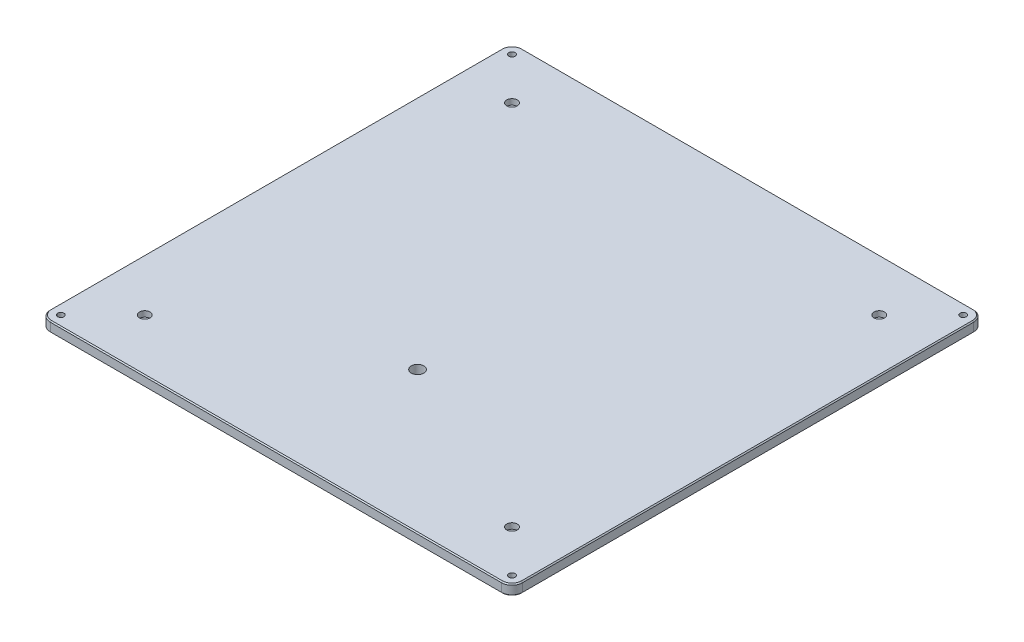
ISO-10303-21;
HEADER;
FILE_DESCRIPTION(('STEP AP214'),'2;1');
FILE_NAME('part.step','',(''),(''),'','','');
FILE_SCHEMA(('AUTOMOTIVE_DESIGN { 1 0 10303 214 1 1 1 1 }'));
ENDSEC;
DATA;
#1=APPLICATION_CONTEXT('core data for automotive mechanical design processes');
#2=APPLICATION_PROTOCOL_DEFINITION('international standard','automotive_design',2000,#1);
#3=PRODUCT_CONTEXT('',#1,'mechanical');
#4=PRODUCT('Part','Part','',(#3));
#5=PRODUCT_RELATED_PRODUCT_CATEGORY('part','',(#4));
#6=PRODUCT_DEFINITION_FORMATION('','',#4);
#7=PRODUCT_DEFINITION_CONTEXT('part definition',#1,'design');
#8=PRODUCT_DEFINITION('design','',#6,#7);
#9=PRODUCT_DEFINITION_SHAPE('','',#8);
#10=(LENGTH_UNIT() NAMED_UNIT(*) SI_UNIT(.MILLI.,.METRE.));
#11=(NAMED_UNIT(*) PLANE_ANGLE_UNIT() SI_UNIT($,.RADIAN.));
#12=(NAMED_UNIT(*) SI_UNIT($,.STERADIAN.) SOLID_ANGLE_UNIT());
#13=UNCERTAINTY_MEASURE_WITH_UNIT(LENGTH_MEASURE(1.E-05),#10,'distance_accuracy_value','');
#14=(GEOMETRIC_REPRESENTATION_CONTEXT(3) GLOBAL_UNCERTAINTY_ASSIGNED_CONTEXT((#13)) GLOBAL_UNIT_ASSIGNED_CONTEXT((#10,
#11,#12)) REPRESENTATION_CONTEXT('',''));
#15=CARTESIAN_POINT('',(0.,0.,0.));
#16=DIRECTION('',(0.,0.,1.));
#17=DIRECTION('',(1.,0.,0.));
#18=AXIS2_PLACEMENT_3D('',#15,#16,#17);
#19=CARTESIAN_POINT('',(175.,10.,175.));
#20=DIRECTION('',(0.,1.,0.));
#21=DIRECTION('',(0.,0.,1.));
#22=AXIS2_PLACEMENT_3D('',#19,#20,#21);
#23=CYLINDRICAL_SURFACE('',#22,5.);
#24=CARTESIAN_POINT('',(175.,4.6,175.));
#25=DIRECTION('',(0.,1.,0.));
#26=DIRECTION('',(0.,0.,1.));
#27=AXIS2_PLACEMENT_3D('',#24,#25,#26);
#28=CIRCLE('',#27,5.);
#29=CARTESIAN_POINT('',(175.,4.6,180.));
#30=VERTEX_POINT('',#29);
#31=EDGE_CURVE('E162',#30,#30,#28,.T.);
#32=ORIENTED_EDGE('',*,*,#31,.F.);
#33=EDGE_LOOP('',(#32));
#34=FACE_BOUND('',#33,.T.);
#35=CARTESIAN_POINT('',(175.,10.,175.));
#36=DIRECTION('',(0.,1.,0.));
#37=DIRECTION('',(0.,0.,1.));
#38=AXIS2_PLACEMENT_3D('',#35,#36,#37);
#39=CIRCLE('',#38,5.);
#40=CARTESIAN_POINT('',(175.,10.,180.));
#41=VERTEX_POINT('',#40);
#42=EDGE_CURVE('E310',#41,#41,#39,.T.);
#43=ORIENTED_EDGE('',*,*,#42,.T.);
#44=EDGE_LOOP('',(#43));
#45=FACE_BOUND('',#44,.T.);
#46=ADVANCED_FACE('F17',(#34,#45),#23,.F.);
#47=CARTESIAN_POINT('',(177.9,4.6,175.));
#48=DIRECTION('',(0.,-1.,0.));
#49=DIRECTION('',(0.,0.,-1.));
#50=AXIS2_PLACEMENT_3D('',#47,#48,#49);
#51=PLANE('',#50);
#52=CARTESIAN_POINT('',(175.,4.6,175.));
#53=DIRECTION('',(0.,1.,0.));
#54=DIRECTION('',(0.,0.,1.));
#55=AXIS2_PLACEMENT_3D('',#52,#53,#54);
#56=CIRCLE('',#55,2.9);
#57=CARTESIAN_POINT('',(175.,4.6,177.9));
#58=VERTEX_POINT('',#57);
#59=EDGE_CURVE('E316',#58,#58,#56,.T.);
#60=ORIENTED_EDGE('',*,*,#59,.F.);
#61=EDGE_LOOP('',(#60));
#62=FACE_BOUND('',#61,.T.);
#63=ORIENTED_EDGE('',*,*,#31,.T.);
#64=EDGE_LOOP('',(#63));
#65=FACE_BOUND('',#64,.T.);
#66=ADVANCED_FACE('F425',(#62,#65),#51,.F.);
#67=CARTESIAN_POINT('',(175.,10.,175.));
#68=DIRECTION('',(0.,1.,0.));
#69=DIRECTION('',(0.,0.,1.));
#70=AXIS2_PLACEMENT_3D('',#67,#68,#69);
#71=CYLINDRICAL_SURFACE('',#70,2.9);
#72=CARTESIAN_POINT('',(175.,0.,175.));
#73=DIRECTION('',(0.,1.,0.));
#74=DIRECTION('',(0.,0.,1.));
#75=AXIS2_PLACEMENT_3D('',#72,#73,#74);
#76=CIRCLE('',#75,2.9);
#77=CARTESIAN_POINT('',(175.,0.,177.9));
#78=VERTEX_POINT('',#77);
#79=EDGE_CURVE('E313',#78,#78,#76,.T.);
#80=ORIENTED_EDGE('',*,*,#79,.F.);
#81=EDGE_LOOP('',(#80));
#82=FACE_BOUND('',#81,.T.);
#83=ORIENTED_EDGE('',*,*,#59,.T.);
#84=EDGE_LOOP('',(#83));
#85=FACE_BOUND('',#84,.T.);
#86=ADVANCED_FACE('F431',(#82,#85),#71,.F.);
#87=CARTESIAN_POINT('',(-175.,10.,175.));
#88=DIRECTION('',(0.,1.,0.));
#89=DIRECTION('',(0.,0.,1.));
#90=AXIS2_PLACEMENT_3D('',#87,#88,#89);
#91=CYLINDRICAL_SURFACE('',#90,5.);
#92=CARTESIAN_POINT('',(-175.,4.6,175.));
#93=DIRECTION('',(0.,1.,0.));
#94=DIRECTION('',(0.,0.,1.));
#95=AXIS2_PLACEMENT_3D('',#92,#93,#94);
#96=CIRCLE('',#95,5.);
#97=CARTESIAN_POINT('',(-175.,4.6,180.));
#98=VERTEX_POINT('',#97);
#99=EDGE_CURVE('E307',#98,#98,#96,.T.);
#100=ORIENTED_EDGE('',*,*,#99,.F.);
#101=EDGE_LOOP('',(#100));
#102=FACE_BOUND('',#101,.T.);
#103=CARTESIAN_POINT('',(-175.,10.,175.));
#104=DIRECTION('',(0.,1.,0.));
#105=DIRECTION('',(0.,0.,1.));
#106=AXIS2_PLACEMENT_3D('',#103,#104,#105);
#107=CIRCLE('',#106,5.);
#108=CARTESIAN_POINT('',(-175.,10.,180.));
#109=VERTEX_POINT('',#108);
#110=EDGE_CURVE('E298',#109,#109,#107,.T.);
#111=ORIENTED_EDGE('',*,*,#110,.T.);
#112=EDGE_LOOP('',(#111));
#113=FACE_BOUND('',#112,.T.);
#114=ADVANCED_FACE('F439',(#102,#113),#91,.F.);
#115=CARTESIAN_POINT('',(-172.1,4.6,175.));
#116=DIRECTION('',(0.,-1.,0.));
#117=DIRECTION('',(0.,0.,-1.));
#118=AXIS2_PLACEMENT_3D('',#115,#116,#117);
#119=PLANE('',#118);
#120=CARTESIAN_POINT('',(-175.,4.6,175.));
#121=DIRECTION('',(0.,1.,0.));
#122=DIRECTION('',(0.,0.,1.));
#123=AXIS2_PLACEMENT_3D('',#120,#121,#122);
#124=CIRCLE('',#123,2.9);
#125=CARTESIAN_POINT('',(-175.,4.6,177.9));
#126=VERTEX_POINT('',#125);
#127=EDGE_CURVE('E304',#126,#126,#124,.T.);
#128=ORIENTED_EDGE('',*,*,#127,.F.);
#129=EDGE_LOOP('',(#128));
#130=FACE_BOUND('',#129,.T.);
#131=ORIENTED_EDGE('',*,*,#99,.T.);
#132=EDGE_LOOP('',(#131));
#133=FACE_BOUND('',#132,.T.);
#134=ADVANCED_FACE('F443',(#130,#133),#119,.F.);
#135=CARTESIAN_POINT('',(-175.,10.,175.));
#136=DIRECTION('',(0.,1.,0.));
#137=DIRECTION('',(0.,0.,1.));
#138=AXIS2_PLACEMENT_3D('',#135,#136,#137);
#139=CYLINDRICAL_SURFACE('',#138,2.9);
#140=CARTESIAN_POINT('',(-175.,0.,175.));
#141=DIRECTION('',(0.,1.,0.));
#142=DIRECTION('',(0.,0.,1.));
#143=AXIS2_PLACEMENT_3D('',#140,#141,#142);
#144=CIRCLE('',#143,2.9);
#145=CARTESIAN_POINT('',(-175.,0.,177.9));
#146=VERTEX_POINT('',#145);
#147=EDGE_CURVE('E301',#146,#146,#144,.T.);
#148=ORIENTED_EDGE('',*,*,#147,.F.);
#149=EDGE_LOOP('',(#148));
#150=FACE_BOUND('',#149,.T.);
#151=ORIENTED_EDGE('',*,*,#127,.T.);
#152=EDGE_LOOP('',(#151));
#153=FACE_BOUND('',#152,.T.);
#154=ADVANCED_FACE('F447',(#150,#153),#139,.F.);
#155=CARTESIAN_POINT('',(-215.,10.,215.));
#156=DIRECTION('',(0.,-1.,0.));
#157=DIRECTION('',(0.,0.,-1.));
#158=AXIS2_PLACEMENT_3D('',#155,#156,#157);
#159=CYLINDRICAL_SURFACE('',#158,10.);
#160=DIRECTION('',(0.,-1.,0.));
#161=VECTOR('',#160,1.);
#162=CARTESIAN_POINT('',(-225.,10.,215.));
#163=LINE('',#162,#161);
#164=CARTESIAN_POINT('',(-225.,9.,215.));
#165=VERTEX_POINT('',#164);
#166=CARTESIAN_POINT('',(-225.,1.00000000000006,215.));
#167=VERTEX_POINT('',#166);
#168=EDGE_CURVE('E281',#165,#167,#163,.T.);
#169=ORIENTED_EDGE('',*,*,#168,.T.);
#170=CARTESIAN_POINT('',(-215.,1.00000000000006,215.));
#171=DIRECTION('',(0.,1.,0.));
#172=DIRECTION('',(0.,0.,1.));
#173=AXIS2_PLACEMENT_3D('',#170,#171,#172);
#174=CIRCLE('',#173,10.);
#175=CARTESIAN_POINT('',(-215.,1.00000000000006,225.));
#176=VERTEX_POINT('',#175);
#177=EDGE_CURVE('E353',#167,#176,#174,.T.);
#178=ORIENTED_EDGE('',*,*,#177,.T.);
#179=DIRECTION('',(0.,-1.,0.));
#180=VECTOR('',#179,1.);
#181=CARTESIAN_POINT('',(-215.,10.,225.));
#182=LINE('',#181,#180);
#183=CARTESIAN_POINT('',(-215.,9.,225.));
#184=VERTEX_POINT('',#183);
#185=EDGE_CURVE('E295',#184,#176,#182,.T.);
#186=ORIENTED_EDGE('',*,*,#185,.F.);
#187=CARTESIAN_POINT('',(-215.,9.,215.));
#188=DIRECTION('',(0.,1.,0.));
#189=DIRECTION('',(0.,0.,1.));
#190=AXIS2_PLACEMENT_3D('',#187,#188,#189);
#191=CIRCLE('',#190,10.);
#192=EDGE_CURVE('E351',#184,#165,#191,.F.);
#193=ORIENTED_EDGE('',*,*,#192,.T.);
#194=EDGE_LOOP('',(#169,#178,#186,#193));
#195=FACE_BOUND('',#194,.T.);
#196=ADVANCED_FACE('F451',(#195),#159,.T.);
#197=CARTESIAN_POINT('',(-215.,10.,225.));
#198=DIRECTION('',(0.,0.,-1.));
#199=DIRECTION('',(-1.,0.,0.));
#200=AXIS2_PLACEMENT_3D('',#197,#198,#199);
#201=PLANE('',#200);
#202=ORIENTED_EDGE('',*,*,#185,.T.);
#203=DIRECTION('',(1.,0.,0.));
#204=VECTOR('',#203,1.);
#205=CARTESIAN_POINT('',(-215.,1.00000000000006,225.));
#206=LINE('',#205,#204);
#207=CARTESIAN_POINT('',(215.,1.00000000000006,225.));
#208=VERTEX_POINT('',#207);
#209=EDGE_CURVE('E361',#176,#208,#206,.T.);
#210=ORIENTED_EDGE('',*,*,#209,.T.);
#211=DIRECTION('',(0.,-1.,0.));
#212=VECTOR('',#211,1.);
#213=CARTESIAN_POINT('',(215.,10.,225.));
#214=LINE('',#213,#212);
#215=CARTESIAN_POINT('',(215.,9.,225.));
#216=VERTEX_POINT('',#215);
#217=EDGE_CURVE('E292',#216,#208,#214,.T.);
#218=ORIENTED_EDGE('',*,*,#217,.F.);
#219=DIRECTION('',(-1.,0.,0.));
#220=VECTOR('',#219,1.);
#221=CARTESIAN_POINT('',(-215.,9.,225.));
#222=LINE('',#221,#220);
#223=EDGE_CURVE('E359',#216,#184,#222,.T.);
#224=ORIENTED_EDGE('',*,*,#223,.T.);
#225=EDGE_LOOP('',(#202,#210,#218,#224));
#226=FACE_BOUND('',#225,.T.);
#227=ADVANCED_FACE('F455',(#226),#201,.F.);
#228=CARTESIAN_POINT('',(215.,10.,215.));
#229=DIRECTION('',(0.,-1.,0.));
#230=DIRECTION('',(0.,0.,-1.));
#231=AXIS2_PLACEMENT_3D('',#228,#229,#230);
#232=CYLINDRICAL_SURFACE('',#231,10.);
#233=ORIENTED_EDGE('',*,*,#217,.T.);
#234=CARTESIAN_POINT('',(215.,1.00000000000006,215.));
#235=DIRECTION('',(0.,1.,0.));
#236=DIRECTION('',(0.,0.,1.));
#237=AXIS2_PLACEMENT_3D('',#234,#235,#236);
#238=CIRCLE('',#237,10.);
#239=CARTESIAN_POINT('',(225.,1.00000000000006,215.));
#240=VERTEX_POINT('',#239);
#241=EDGE_CURVE('E357',#208,#240,#238,.T.);
#242=ORIENTED_EDGE('',*,*,#241,.T.);
#243=DIRECTION('',(0.,-1.,0.));
#244=VECTOR('',#243,1.);
#245=CARTESIAN_POINT('',(225.,10.,215.));
#246=LINE('',#245,#244);
#247=CARTESIAN_POINT('',(225.,9.,215.));
#248=VERTEX_POINT('',#247);
#249=EDGE_CURVE('E289',#248,#240,#246,.T.);
#250=ORIENTED_EDGE('',*,*,#249,.F.);
#251=CARTESIAN_POINT('',(215.,9.,215.));
#252=DIRECTION('',(0.,1.,0.));
#253=DIRECTION('',(0.,0.,1.));
#254=AXIS2_PLACEMENT_3D('',#251,#252,#253);
#255=CIRCLE('',#254,10.);
#256=EDGE_CURVE('E355',#248,#216,#255,.F.);
#257=ORIENTED_EDGE('',*,*,#256,.T.);
#258=EDGE_LOOP('',(#233,#242,#250,#257));
#259=FACE_BOUND('',#258,.T.);
#260=ADVANCED_FACE('F459',(#259),#232,.T.);
#261=CARTESIAN_POINT('',(225.,10.,-215.));
#262=DIRECTION('',(-1.,0.,0.));
#263=DIRECTION('',(0.,0.,1.));
#264=AXIS2_PLACEMENT_3D('',#261,#262,#263);
#265=PLANE('',#264);
#266=ORIENTED_EDGE('',*,*,#249,.T.);
#267=DIRECTION('',(0.,0.,-1.));
#268=VECTOR('',#267,1.);
#269=CARTESIAN_POINT('',(225.,1.00000000000006,-215.));
#270=LINE('',#269,#268);
#271=CARTESIAN_POINT('',(225.,1.00000000000006,-215.));
#272=VERTEX_POINT('',#271);
#273=EDGE_CURVE('E349',#240,#272,#270,.T.);
#274=ORIENTED_EDGE('',*,*,#273,.T.);
#275=DIRECTION('',(0.,-1.,0.));
#276=VECTOR('',#275,1.);
#277=CARTESIAN_POINT('',(225.,10.,-215.));
#278=LINE('',#277,#276);
#279=CARTESIAN_POINT('',(225.,9.,-215.));
#280=VERTEX_POINT('',#279);
#281=EDGE_CURVE('E286',#280,#272,#278,.T.);
#282=ORIENTED_EDGE('',*,*,#281,.F.);
#283=DIRECTION('',(0.,0.,1.));
#284=VECTOR('',#283,1.);
#285=CARTESIAN_POINT('',(225.,9.,215.));
#286=LINE('',#285,#284);
#287=EDGE_CURVE('E347',#280,#248,#286,.T.);
#288=ORIENTED_EDGE('',*,*,#287,.T.);
#289=EDGE_LOOP('',(#266,#274,#282,#288));
#290=FACE_BOUND('',#289,.T.);
#291=ADVANCED_FACE('F398',(#290),#265,.F.);
#292=CARTESIAN_POINT('',(215.,10.,-215.));
#293=DIRECTION('',(0.,-1.,0.));
#294=DIRECTION('',(0.,0.,-1.));
#295=AXIS2_PLACEMENT_3D('',#292,#293,#294);
#296=CYLINDRICAL_SURFACE('',#295,10.);
#297=ORIENTED_EDGE('',*,*,#281,.T.);
#298=CARTESIAN_POINT('',(215.,1.00000000000006,-215.));
#299=DIRECTION('',(0.,1.,0.));
#300=DIRECTION('',(0.,0.,1.));
#301=AXIS2_PLACEMENT_3D('',#298,#299,#300);
#302=CIRCLE('',#301,10.);
#303=CARTESIAN_POINT('',(215.,1.00000000000006,-225.));
#304=VERTEX_POINT('',#303);
#305=EDGE_CURVE('E341',#272,#304,#302,.T.);
#306=ORIENTED_EDGE('',*,*,#305,.T.);
#307=DIRECTION('',(0.,-1.,0.));
#308=VECTOR('',#307,1.);
#309=CARTESIAN_POINT('',(215.,10.,-225.));
#310=LINE('',#309,#308);
#311=CARTESIAN_POINT('',(215.,9.,-225.));
#312=VERTEX_POINT('',#311);
#313=EDGE_CURVE('E157',#312,#304,#310,.T.);
#314=ORIENTED_EDGE('',*,*,#313,.F.);
#315=CARTESIAN_POINT('',(215.,9.,-215.));
#316=DIRECTION('',(0.,1.,0.));
#317=DIRECTION('',(0.,0.,1.));
#318=AXIS2_PLACEMENT_3D('',#315,#316,#317);
#319=CIRCLE('',#318,10.);
#320=EDGE_CURVE('E339',#312,#280,#319,.F.);
#321=ORIENTED_EDGE('',*,*,#320,.T.);
#322=EDGE_LOOP('',(#297,#306,#314,#321));
#323=FACE_BOUND('',#322,.T.);
#324=ADVANCED_FACE('F395',(#323),#296,.T.);
#325=CARTESIAN_POINT('',(-215.,10.,-225.));
#326=DIRECTION('',(0.,0.,1.));
#327=DIRECTION('',(1.,0.,0.));
#328=AXIS2_PLACEMENT_3D('',#325,#326,#327);
#329=PLANE('',#328);
#330=ORIENTED_EDGE('',*,*,#313,.T.);
#331=DIRECTION('',(-1.,0.,0.));
#332=VECTOR('',#331,1.);
#333=CARTESIAN_POINT('',(-215.,1.00000000000006,-225.));
#334=LINE('',#333,#332);
#335=CARTESIAN_POINT('',(-215.,1.00000000000006,-225.));
#336=VERTEX_POINT('',#335);
#337=EDGE_CURVE('E156',#304,#336,#334,.T.);
#338=ORIENTED_EDGE('',*,*,#337,.T.);
#339=DIRECTION('',(0.,-1.,0.));
#340=VECTOR('',#339,1.);
#341=CARTESIAN_POINT('',(-215.,10.,-225.));
#342=LINE('',#341,#340);
#343=CARTESIAN_POINT('',(-215.,9.,-225.));
#344=VERTEX_POINT('',#343);
#345=EDGE_CURVE('E139',#344,#336,#342,.T.);
#346=ORIENTED_EDGE('',*,*,#345,.F.);
#347=DIRECTION('',(1.,0.,0.));
#348=VECTOR('',#347,1.);
#349=CARTESIAN_POINT('',(215.,9.,-225.));
#350=LINE('',#349,#348);
#351=EDGE_CURVE('E153',#344,#312,#350,.T.);
#352=ORIENTED_EDGE('',*,*,#351,.T.);
#353=EDGE_LOOP('',(#330,#338,#346,#352));
#354=FACE_BOUND('',#353,.T.);
#355=ADVANCED_FACE('F152',(#354),#329,.F.);
#356=CARTESIAN_POINT('',(-215.,10.,-215.));
#357=DIRECTION('',(0.,-1.,0.));
#358=DIRECTION('',(0.,0.,-1.));
#359=AXIS2_PLACEMENT_3D('',#356,#357,#358);
#360=CYLINDRICAL_SURFACE('',#359,10.);
#361=ORIENTED_EDGE('',*,*,#345,.T.);
#362=CARTESIAN_POINT('',(-215.,1.00000000000006,-215.));
#363=DIRECTION('',(0.,1.,0.));
#364=DIRECTION('',(0.,0.,1.));
#365=AXIS2_PLACEMENT_3D('',#362,#363,#364);
#366=CIRCLE('',#365,10.);
#367=CARTESIAN_POINT('',(-225.,1.00000000000006,-215.));
#368=VERTEX_POINT('',#367);
#369=EDGE_CURVE('E145',#336,#368,#366,.T.);
#370=ORIENTED_EDGE('',*,*,#369,.T.);
#371=DIRECTION('',(0.,-1.,0.));
#372=VECTOR('',#371,1.);
#373=CARTESIAN_POINT('',(-225.,10.,-215.));
#374=LINE('',#373,#372);
#375=CARTESIAN_POINT('',(-225.,9.,-215.));
#376=VERTEX_POINT('',#375);
#377=EDGE_CURVE('E141',#376,#368,#374,.T.);
#378=ORIENTED_EDGE('',*,*,#377,.F.);
#379=CARTESIAN_POINT('',(-215.,9.,-215.));
#380=DIRECTION('',(0.,1.,0.));
#381=DIRECTION('',(0.,0.,1.));
#382=AXIS2_PLACEMENT_3D('',#379,#380,#381);
#383=CIRCLE('',#382,10.);
#384=EDGE_CURVE('E136',#376,#344,#383,.F.);
#385=ORIENTED_EDGE('',*,*,#384,.T.);
#386=EDGE_LOOP('',(#361,#370,#378,#385));
#387=FACE_BOUND('',#386,.T.);
#388=ADVANCED_FACE('F138',(#387),#360,.T.);
#389=CARTESIAN_POINT('',(-225.,10.,-215.));
#390=DIRECTION('',(1.,0.,0.));
#391=DIRECTION('',(0.,0.,-1.));
#392=AXIS2_PLACEMENT_3D('',#389,#390,#391);
#393=PLANE('',#392);
#394=ORIENTED_EDGE('',*,*,#377,.T.);
#395=DIRECTION('',(0.,0.,1.));
#396=VECTOR('',#395,1.);
#397=CARTESIAN_POINT('',(-225.,1.00000000000006,-215.));
#398=LINE('',#397,#396);
#399=EDGE_CURVE('E345',#368,#167,#398,.T.);
#400=ORIENTED_EDGE('',*,*,#399,.T.);
#401=ORIENTED_EDGE('',*,*,#168,.F.);
#402=DIRECTION('',(0.,0.,-1.));
#403=VECTOR('',#402,1.);
#404=CARTESIAN_POINT('',(-225.,9.,-215.));
#405=LINE('',#404,#403);
#406=EDGE_CURVE('E343',#165,#376,#405,.T.);
#407=ORIENTED_EDGE('',*,*,#406,.T.);
#408=EDGE_LOOP('',(#394,#400,#401,#407));
#409=FACE_BOUND('',#408,.T.);
#410=ADVANCED_FACE('F472',(#409),#393,.F.);
#411=CARTESIAN_POINT('',(-215.,10.,215.));
#412=DIRECTION('',(0.,1.,0.));
#413=DIRECTION('',(0.,0.,1.));
#414=AXIS2_PLACEMENT_3D('',#411,#412,#413);
#415=PLANE('',#414);
#416=CARTESIAN_POINT('',(215.,10.,-215.));
#417=DIRECTION('',(0.,1.,0.));
#418=DIRECTION('',(0.,0.,1.));
#419=AXIS2_PLACEMENT_3D('',#416,#417,#418);
#420=CIRCLE('',#419,9.);
#421=CARTESIAN_POINT('',(224.,10.,-215.));
#422=VERTEX_POINT('',#421);
#423=CARTESIAN_POINT('',(215.,10.,-224.));
#424=VERTEX_POINT('',#423);
#425=EDGE_CURVE('E42',#422,#424,#420,.T.);
#426=ORIENTED_EDGE('',*,*,#425,.T.);
#427=DIRECTION('',(-1.,0.,0.));
#428=VECTOR('',#427,1.);
#429=CARTESIAN_POINT('',(-215.,10.,-224.));
#430=LINE('',#429,#428);
#431=CARTESIAN_POINT('',(-215.,10.,-224.));
#432=VERTEX_POINT('',#431);
#433=EDGE_CURVE('E11',#424,#432,#430,.T.);
#434=ORIENTED_EDGE('',*,*,#433,.T.);
#435=CARTESIAN_POINT('',(-215.,10.,-215.));
#436=DIRECTION('',(0.,1.,0.));
#437=DIRECTION('',(0.,0.,1.));
#438=AXIS2_PLACEMENT_3D('',#435,#436,#437);
#439=CIRCLE('',#438,9.);
#440=CARTESIAN_POINT('',(-224.,10.,-215.));
#441=VERTEX_POINT('',#440);
#442=EDGE_CURVE('E27',#432,#441,#439,.T.);
#443=ORIENTED_EDGE('',*,*,#442,.T.);
#444=DIRECTION('',(0.,0.,1.));
#445=VECTOR('',#444,1.);
#446=CARTESIAN_POINT('',(-224.,10.,215.));
#447=LINE('',#446,#445);
#448=CARTESIAN_POINT('',(-224.,10.,215.));
#449=VERTEX_POINT('',#448);
#450=EDGE_CURVE('E371',#441,#449,#447,.T.);
#451=ORIENTED_EDGE('',*,*,#450,.T.);
#452=CARTESIAN_POINT('',(-215.,10.,215.));
#453=DIRECTION('',(0.,1.,0.));
#454=DIRECTION('',(0.,0.,1.));
#455=AXIS2_PLACEMENT_3D('',#452,#453,#454);
#456=CIRCLE('',#455,9.);
#457=CARTESIAN_POINT('',(-215.,10.,224.));
#458=VERTEX_POINT('',#457);
#459=EDGE_CURVE('E367',#449,#458,#456,.T.);
#460=ORIENTED_EDGE('',*,*,#459,.T.);
#461=DIRECTION('',(1.,0.,0.));
#462=VECTOR('',#461,1.);
#463=CARTESIAN_POINT('',(215.,10.,224.));
#464=LINE('',#463,#462);
#465=CARTESIAN_POINT('',(215.,10.,224.));
#466=VERTEX_POINT('',#465);
#467=EDGE_CURVE('E363',#458,#466,#464,.T.);
#468=ORIENTED_EDGE('',*,*,#467,.T.);
#469=CARTESIAN_POINT('',(215.,10.,215.));
#470=DIRECTION('',(0.,1.,0.));
#471=DIRECTION('',(0.,0.,1.));
#472=AXIS2_PLACEMENT_3D('',#469,#470,#471);
#473=CIRCLE('',#472,9.);
#474=CARTESIAN_POINT('',(224.,10.,215.));
#475=VERTEX_POINT('',#474);
#476=EDGE_CURVE('E365',#466,#475,#473,.T.);
#477=ORIENTED_EDGE('',*,*,#476,.T.);
#478=DIRECTION('',(0.,0.,-1.));
#479=VECTOR('',#478,1.);
#480=CARTESIAN_POINT('',(224.,10.,-215.));
#481=LINE('',#480,#479);
#482=EDGE_CURVE('E369',#475,#422,#481,.T.);
#483=ORIENTED_EDGE('',*,*,#482,.T.);
#484=EDGE_LOOP('',(#426,#434,#443,#451,#460,#468,#477,#483));
#485=FACE_BOUND('',#484,.T.);
#486=CARTESIAN_POINT('',(0.,10.,90.));
#487=DIRECTION('',(0.,1.,0.));
#488=DIRECTION('',(0.,0.,1.));
#489=AXIS2_PLACEMENT_3D('',#486,#487,#488);
#490=CIRCLE('',#489,6.);
#491=CARTESIAN_POINT('',(0.,10.,96.));
#492=VERTEX_POINT('',#491);
#493=EDGE_CURVE('E220',#492,#492,#490,.T.);
#494=ORIENTED_EDGE('',*,*,#493,.F.);
#495=EDGE_LOOP('',(#494));
#496=FACE_BOUND('',#495,.T.);
#497=CARTESIAN_POINT('',(175.,10.,-175.));
#498=DIRECTION('',(0.,1.,0.));
#499=DIRECTION('',(0.,0.,1.));
#500=AXIS2_PLACEMENT_3D('',#497,#498,#499);
#501=CIRCLE('',#500,5.);
#502=CARTESIAN_POINT('',(175.,10.,-170.));
#503=VERTEX_POINT('',#502);
#504=EDGE_CURVE('E231',#503,#503,#501,.T.);
#505=ORIENTED_EDGE('',*,*,#504,.F.);
#506=EDGE_LOOP('',(#505));
#507=FACE_BOUND('',#506,.T.);
#508=CARTESIAN_POINT('',(-175.,10.,-175.));
#509=DIRECTION('',(0.,1.,0.));
#510=DIRECTION('',(0.,0.,1.));
#511=AXIS2_PLACEMENT_3D('',#508,#509,#510);
#512=CIRCLE('',#511,5.);
#513=CARTESIAN_POINT('',(-175.,10.,-170.));
#514=VERTEX_POINT('',#513);
#515=EDGE_CURVE('E245',#514,#514,#512,.T.);
#516=ORIENTED_EDGE('',*,*,#515,.F.);
#517=EDGE_LOOP('',(#516));
#518=FACE_BOUND('',#517,.T.);
#519=CARTESIAN_POINT('',(215.,10.,-215.));
#520=DIRECTION('',(0.,1.,0.));
#521=DIRECTION('',(0.,0.,1.));
#522=AXIS2_PLACEMENT_3D('',#519,#520,#521);
#523=CIRCLE('',#522,3.);
#524=CARTESIAN_POINT('',(215.,10.,-212.));
#525=VERTEX_POINT('',#524);
#526=EDGE_CURVE('E261',#525,#525,#523,.T.);
#527=ORIENTED_EDGE('',*,*,#526,.F.);
#528=EDGE_LOOP('',(#527));
#529=FACE_BOUND('',#528,.T.);
#530=CARTESIAN_POINT('',(-215.,10.,215.));
#531=DIRECTION('',(0.,1.,0.));
#532=DIRECTION('',(0.,0.,1.));
#533=AXIS2_PLACEMENT_3D('',#530,#531,#532);
#534=CIRCLE('',#533,3.);
#535=CARTESIAN_POINT('',(-215.,10.,218.));
#536=VERTEX_POINT('',#535);
#537=EDGE_CURVE('E262',#536,#536,#534,.T.);
#538=ORIENTED_EDGE('',*,*,#537,.F.);
#539=EDGE_LOOP('',(#538));
#540=FACE_BOUND('',#539,.T.);
#541=CARTESIAN_POINT('',(215.,10.,215.));
#542=DIRECTION('',(0.,1.,0.));
#543=DIRECTION('',(0.,0.,1.));
#544=AXIS2_PLACEMENT_3D('',#541,#542,#543);
#545=CIRCLE('',#544,3.);
#546=CARTESIAN_POINT('',(215.,10.,218.));
#547=VERTEX_POINT('',#546);
#548=EDGE_CURVE('E269',#547,#547,#545,.T.);
#549=ORIENTED_EDGE('',*,*,#548,.F.);
#550=EDGE_LOOP('',(#549));
#551=FACE_BOUND('',#550,.T.);
#552=CARTESIAN_POINT('',(-215.,10.,-215.));
#553=DIRECTION('',(0.,1.,0.));
#554=DIRECTION('',(0.,0.,1.));
#555=AXIS2_PLACEMENT_3D('',#552,#553,#554);
#556=CIRCLE('',#555,3.);
#557=CARTESIAN_POINT('',(-215.,10.,-212.));
#558=VERTEX_POINT('',#557);
#559=EDGE_CURVE('E265',#558,#558,#556,.T.);
#560=ORIENTED_EDGE('',*,*,#559,.F.);
#561=EDGE_LOOP('',(#560));
#562=FACE_BOUND('',#561,.T.);
#563=ORIENTED_EDGE('',*,*,#110,.F.);
#564=EDGE_LOOP('',(#563));
#565=FACE_BOUND('',#564,.T.);
#566=ORIENTED_EDGE('',*,*,#42,.F.);
#567=EDGE_LOOP('',(#566));
#568=FACE_BOUND('',#567,.T.);
#569=ADVANCED_FACE('F374',(#485,#496,#507,#518,#529,#540,#551,#562,#565,#568),#415,.T.);
#570=CARTESIAN_POINT('',(-215.,0.,215.));
#571=DIRECTION('',(0.,1.,0.));
#572=DIRECTION('',(0.,0.,1.));
#573=AXIS2_PLACEMENT_3D('',#570,#571,#572);
#574=PLANE('',#573);
#575=CARTESIAN_POINT('',(-215.,0.,-215.));
#576=DIRECTION('',(0.,1.,0.));
#577=DIRECTION('',(0.,0.,1.));
#578=AXIS2_PLACEMENT_3D('',#575,#576,#577);
#579=CIRCLE('',#578,9.);
#580=CARTESIAN_POINT('',(-224.,0.,-215.));
#581=VERTEX_POINT('',#580);
#582=CARTESIAN_POINT('',(-215.,0.,-224.));
#583=VERTEX_POINT('',#582);
#584=EDGE_CURVE('E334',#581,#583,#579,.F.);
#585=ORIENTED_EDGE('',*,*,#584,.T.);
#586=DIRECTION('',(1.,0.,0.));
#587=VECTOR('',#586,1.);
#588=CARTESIAN_POINT('',(-215.,0.,-224.));
#589=LINE('',#588,#587);
#590=CARTESIAN_POINT('',(215.,0.,-224.));
#591=VERTEX_POINT('',#590);
#592=EDGE_CURVE('E146',#583,#591,#589,.T.);
#593=ORIENTED_EDGE('',*,*,#592,.T.);
#594=CARTESIAN_POINT('',(215.,0.,-215.));
#595=DIRECTION('',(0.,1.,0.));
#596=DIRECTION('',(0.,0.,1.));
#597=AXIS2_PLACEMENT_3D('',#594,#595,#596);
#598=CIRCLE('',#597,9.);
#599=CARTESIAN_POINT('',(224.,0.,-215.));
#600=VERTEX_POINT('',#599);
#601=EDGE_CURVE('E332',#591,#600,#598,.F.);
#602=ORIENTED_EDGE('',*,*,#601,.T.);
#603=DIRECTION('',(0.,0.,1.));
#604=VECTOR('',#603,1.);
#605=CARTESIAN_POINT('',(224.,0.,215.));
#606=LINE('',#605,#604);
#607=CARTESIAN_POINT('',(224.,0.,215.));
#608=VERTEX_POINT('',#607);
#609=EDGE_CURVE('E328',#600,#608,#606,.T.);
#610=ORIENTED_EDGE('',*,*,#609,.T.);
#611=CARTESIAN_POINT('',(215.,0.,215.));
#612=DIRECTION('',(0.,1.,0.));
#613=DIRECTION('',(0.,0.,1.));
#614=AXIS2_PLACEMENT_3D('',#611,#612,#613);
#615=CIRCLE('',#614,9.);
#616=CARTESIAN_POINT('',(215.,0.,224.));
#617=VERTEX_POINT('',#616);
#618=EDGE_CURVE('E324',#608,#617,#615,.F.);
#619=ORIENTED_EDGE('',*,*,#618,.T.);
#620=DIRECTION('',(-1.,0.,0.));
#621=VECTOR('',#620,1.);
#622=CARTESIAN_POINT('',(-215.,0.,224.));
#623=LINE('',#622,#621);
#624=CARTESIAN_POINT('',(-215.,0.,224.));
#625=VERTEX_POINT('',#624);
#626=EDGE_CURVE('E322',#617,#625,#623,.T.);
#627=ORIENTED_EDGE('',*,*,#626,.T.);
#628=CARTESIAN_POINT('',(-215.,0.,215.));
#629=DIRECTION('',(0.,1.,0.));
#630=DIRECTION('',(0.,0.,1.));
#631=AXIS2_PLACEMENT_3D('',#628,#629,#630);
#632=CIRCLE('',#631,9.);
#633=CARTESIAN_POINT('',(-224.,0.,215.));
#634=VERTEX_POINT('',#633);
#635=EDGE_CURVE('E326',#625,#634,#632,.F.);
#636=ORIENTED_EDGE('',*,*,#635,.T.);
#637=DIRECTION('',(0.,0.,-1.));
#638=VECTOR('',#637,1.);
#639=CARTESIAN_POINT('',(-224.,0.,215.));
#640=LINE('',#639,#638);
#641=EDGE_CURVE('E330',#634,#581,#640,.T.);
#642=ORIENTED_EDGE('',*,*,#641,.T.);
#643=EDGE_LOOP('',(#585,#593,#602,#610,#619,#627,#636,#642));
#644=FACE_BOUND('',#643,.T.);
#645=CARTESIAN_POINT('',(0.,0.,90.));
#646=DIRECTION('',(0.,1.,0.));
#647=DIRECTION('',(0.,0.,1.));
#648=AXIS2_PLACEMENT_3D('',#645,#646,#647);
#649=CIRCLE('',#648,6.);
#650=CARTESIAN_POINT('',(0.,0.,96.));
#651=VERTEX_POINT('',#650);
#652=EDGE_CURVE('E226',#651,#651,#649,.T.);
#653=ORIENTED_EDGE('',*,*,#652,.T.);
#654=EDGE_LOOP('',(#653));
#655=FACE_BOUND('',#654,.T.);
#656=CARTESIAN_POINT('',(175.,0.,-175.));
#657=DIRECTION('',(0.,1.,0.));
#658=DIRECTION('',(0.,0.,1.));
#659=AXIS2_PLACEMENT_3D('',#656,#657,#658);
#660=CIRCLE('',#659,2.9);
#661=CARTESIAN_POINT('',(175.,0.,-172.1));
#662=VERTEX_POINT('',#661);
#663=EDGE_CURVE('E236',#662,#662,#660,.T.);
#664=ORIENTED_EDGE('',*,*,#663,.T.);
#665=EDGE_LOOP('',(#664));
#666=FACE_BOUND('',#665,.T.);
#667=CARTESIAN_POINT('',(-175.,0.,-175.));
#668=DIRECTION('',(0.,1.,0.));
#669=DIRECTION('',(0.,0.,1.));
#670=AXIS2_PLACEMENT_3D('',#667,#668,#669);
#671=CIRCLE('',#670,2.9);
#672=CARTESIAN_POINT('',(-175.,0.,-172.1));
#673=VERTEX_POINT('',#672);
#674=EDGE_CURVE('E254',#673,#673,#671,.T.);
#675=ORIENTED_EDGE('',*,*,#674,.T.);
#676=EDGE_LOOP('',(#675));
#677=FACE_BOUND('',#676,.T.);
#678=CARTESIAN_POINT('',(215.,0.,-215.));
#679=DIRECTION('',(0.,1.,0.));
#680=DIRECTION('',(0.,0.,1.));
#681=AXIS2_PLACEMENT_3D('',#678,#679,#680);
#682=CIRCLE('',#681,3.);
#683=CARTESIAN_POINT('',(215.,0.,-212.));
#684=VERTEX_POINT('',#683);
#685=EDGE_CURVE('E258',#684,#684,#682,.T.);
#686=ORIENTED_EDGE('',*,*,#685,.T.);
#687=EDGE_LOOP('',(#686));
#688=FACE_BOUND('',#687,.T.);
#689=CARTESIAN_POINT('',(-215.,0.,215.));
#690=DIRECTION('',(0.,1.,0.));
#691=DIRECTION('',(0.,0.,1.));
#692=AXIS2_PLACEMENT_3D('',#689,#690,#691);
#693=CIRCLE('',#692,3.);
#694=CARTESIAN_POINT('',(-215.,0.,218.));
#695=VERTEX_POINT('',#694);
#696=EDGE_CURVE('E266',#695,#695,#693,.T.);
#697=ORIENTED_EDGE('',*,*,#696,.T.);
#698=EDGE_LOOP('',(#697));
#699=FACE_BOUND('',#698,.T.);
#700=CARTESIAN_POINT('',(215.,0.,215.));
#701=DIRECTION('',(0.,1.,0.));
#702=DIRECTION('',(0.,0.,1.));
#703=AXIS2_PLACEMENT_3D('',#700,#701,#702);
#704=CIRCLE('',#703,3.);
#705=CARTESIAN_POINT('',(215.,0.,218.));
#706=VERTEX_POINT('',#705);
#707=EDGE_CURVE('E257',#706,#706,#704,.T.);
#708=ORIENTED_EDGE('',*,*,#707,.T.);
#709=EDGE_LOOP('',(#708));
#710=FACE_BOUND('',#709,.T.);
#711=CARTESIAN_POINT('',(-215.,0.,-215.));
#712=DIRECTION('',(0.,1.,0.));
#713=DIRECTION('',(0.,0.,1.));
#714=AXIS2_PLACEMENT_3D('',#711,#712,#713);
#715=CIRCLE('',#714,3.);
#716=CARTESIAN_POINT('',(-215.,0.,-212.));
#717=VERTEX_POINT('',#716);
#718=EDGE_CURVE('E278',#717,#717,#715,.T.);
#719=ORIENTED_EDGE('',*,*,#718,.T.);
#720=EDGE_LOOP('',(#719));
#721=FACE_BOUND('',#720,.T.);
#722=ORIENTED_EDGE('',*,*,#147,.T.);
#723=EDGE_LOOP('',(#722));
#724=FACE_BOUND('',#723,.T.);
#725=ORIENTED_EDGE('',*,*,#79,.T.);
#726=EDGE_LOOP('',(#725));
#727=FACE_BOUND('',#726,.T.);
#728=ADVANCED_FACE('F476',(#644,#655,#666,#677,#688,#699,#710,#721,#724,#727),#574,.F.);
#729=CARTESIAN_POINT('',(-215.,10.,-215.));
#730=DIRECTION('',(0.,1.,0.));
#731=DIRECTION('',(0.,0.,1.));
#732=AXIS2_PLACEMENT_3D('',#729,#730,#731);
#733=CYLINDRICAL_SURFACE('',#732,3.);
#734=ORIENTED_EDGE('',*,*,#718,.F.);
#735=EDGE_LOOP('',(#734));
#736=FACE_BOUND('',#735,.T.);
#737=ORIENTED_EDGE('',*,*,#559,.T.);
#738=EDGE_LOOP('',(#737));
#739=FACE_BOUND('',#738,.T.);
#740=ADVANCED_FACE('F479',(#736,#739),#733,.F.);
#741=CARTESIAN_POINT('',(215.,10.,215.));
#742=DIRECTION('',(0.,1.,0.));
#743=DIRECTION('',(0.,0.,1.));
#744=AXIS2_PLACEMENT_3D('',#741,#742,#743);
#745=CYLINDRICAL_SURFACE('',#744,3.);
#746=ORIENTED_EDGE('',*,*,#707,.F.);
#747=EDGE_LOOP('',(#746));
#748=FACE_BOUND('',#747,.T.);
#749=ORIENTED_EDGE('',*,*,#548,.T.);
#750=EDGE_LOOP('',(#749));
#751=FACE_BOUND('',#750,.T.);
#752=ADVANCED_FACE('F485',(#748,#751),#745,.F.);
#753=CARTESIAN_POINT('',(-215.,10.,215.));
#754=DIRECTION('',(0.,1.,0.));
#755=DIRECTION('',(0.,0.,1.));
#756=AXIS2_PLACEMENT_3D('',#753,#754,#755);
#757=CYLINDRICAL_SURFACE('',#756,3.);
#758=ORIENTED_EDGE('',*,*,#696,.F.);
#759=EDGE_LOOP('',(#758));
#760=FACE_BOUND('',#759,.T.);
#761=ORIENTED_EDGE('',*,*,#537,.T.);
#762=EDGE_LOOP('',(#761));
#763=FACE_BOUND('',#762,.T.);
#764=ADVANCED_FACE('F489',(#760,#763),#757,.F.);
#765=CARTESIAN_POINT('',(215.,10.,-215.));
#766=DIRECTION('',(0.,1.,0.));
#767=DIRECTION('',(0.,0.,1.));
#768=AXIS2_PLACEMENT_3D('',#765,#766,#767);
#769=CYLINDRICAL_SURFACE('',#768,3.);
#770=ORIENTED_EDGE('',*,*,#685,.F.);
#771=EDGE_LOOP('',(#770));
#772=FACE_BOUND('',#771,.T.);
#773=ORIENTED_EDGE('',*,*,#526,.T.);
#774=EDGE_LOOP('',(#773));
#775=FACE_BOUND('',#774,.T.);
#776=ADVANCED_FACE('F493',(#772,#775),#769,.F.);
#777=CARTESIAN_POINT('',(-175.,10.,-175.));
#778=DIRECTION('',(0.,1.,0.));
#779=DIRECTION('',(0.,0.,1.));
#780=AXIS2_PLACEMENT_3D('',#777,#778,#779);
#781=CYLINDRICAL_SURFACE('',#780,2.9);
#782=ORIENTED_EDGE('',*,*,#674,.F.);
#783=EDGE_LOOP('',(#782));
#784=FACE_BOUND('',#783,.T.);
#785=CARTESIAN_POINT('',(-175.,4.6,-175.));
#786=DIRECTION('',(0.,1.,0.));
#787=DIRECTION('',(0.,0.,1.));
#788=AXIS2_PLACEMENT_3D('',#785,#786,#787);
#789=CIRCLE('',#788,2.9);
#790=CARTESIAN_POINT('',(-175.,4.6,-172.1));
#791=VERTEX_POINT('',#790);
#792=EDGE_CURVE('E251',#791,#791,#789,.T.);
#793=ORIENTED_EDGE('',*,*,#792,.T.);
#794=EDGE_LOOP('',(#793));
#795=FACE_BOUND('',#794,.T.);
#796=ADVANCED_FACE('F497',(#784,#795),#781,.F.);
#797=CARTESIAN_POINT('',(-172.1,4.6,-175.));
#798=DIRECTION('',(0.,-1.,0.));
#799=DIRECTION('',(0.,0.,-1.));
#800=AXIS2_PLACEMENT_3D('',#797,#798,#799);
#801=PLANE('',#800);
#802=ORIENTED_EDGE('',*,*,#792,.F.);
#803=EDGE_LOOP('',(#802));
#804=FACE_BOUND('',#803,.T.);
#805=CARTESIAN_POINT('',(-175.,4.6,-175.));
#806=DIRECTION('',(0.,1.,0.));
#807=DIRECTION('',(0.,0.,1.));
#808=AXIS2_PLACEMENT_3D('',#805,#806,#807);
#809=CIRCLE('',#808,5.);
#810=CARTESIAN_POINT('',(-175.,4.6,-170.));
#811=VERTEX_POINT('',#810);
#812=EDGE_CURVE('E248',#811,#811,#809,.T.);
#813=ORIENTED_EDGE('',*,*,#812,.T.);
#814=EDGE_LOOP('',(#813));
#815=FACE_BOUND('',#814,.T.);
#816=ADVANCED_FACE('F501',(#804,#815),#801,.F.);
#817=CARTESIAN_POINT('',(-175.,10.,-175.));
#818=DIRECTION('',(0.,1.,0.));
#819=DIRECTION('',(0.,0.,1.));
#820=AXIS2_PLACEMENT_3D('',#817,#818,#819);
#821=CYLINDRICAL_SURFACE('',#820,5.);
#822=ORIENTED_EDGE('',*,*,#812,.F.);
#823=EDGE_LOOP('',(#822));
#824=FACE_BOUND('',#823,.T.);
#825=ORIENTED_EDGE('',*,*,#515,.T.);
#826=EDGE_LOOP('',(#825));
#827=FACE_BOUND('',#826,.T.);
#828=ADVANCED_FACE('F505',(#824,#827),#821,.F.);
#829=CARTESIAN_POINT('',(175.,10.,-175.));
#830=DIRECTION('',(0.,1.,0.));
#831=DIRECTION('',(0.,0.,1.));
#832=AXIS2_PLACEMENT_3D('',#829,#830,#831);
#833=CYLINDRICAL_SURFACE('',#832,2.9);
#834=ORIENTED_EDGE('',*,*,#663,.F.);
#835=EDGE_LOOP('',(#834));
#836=FACE_BOUND('',#835,.T.);
#837=CARTESIAN_POINT('',(175.,4.6,-175.));
#838=DIRECTION('',(0.,1.,0.));
#839=DIRECTION('',(0.,0.,1.));
#840=AXIS2_PLACEMENT_3D('',#837,#838,#839);
#841=CIRCLE('',#840,2.9);
#842=CARTESIAN_POINT('',(175.,4.6,-172.1));
#843=VERTEX_POINT('',#842);
#844=EDGE_CURVE('E242',#843,#843,#841,.T.);
#845=ORIENTED_EDGE('',*,*,#844,.T.);
#846=EDGE_LOOP('',(#845));
#847=FACE_BOUND('',#846,.T.);
#848=ADVANCED_FACE('F509',(#836,#847),#833,.F.);
#849=CARTESIAN_POINT('',(177.9,4.6,-175.));
#850=DIRECTION('',(0.,-1.,0.));
#851=DIRECTION('',(0.,0.,-1.));
#852=AXIS2_PLACEMENT_3D('',#849,#850,#851);
#853=PLANE('',#852);
#854=ORIENTED_EDGE('',*,*,#844,.F.);
#855=EDGE_LOOP('',(#854));
#856=FACE_BOUND('',#855,.T.);
#857=CARTESIAN_POINT('',(175.,4.6,-175.));
#858=DIRECTION('',(0.,1.,0.));
#859=DIRECTION('',(0.,0.,1.));
#860=AXIS2_PLACEMENT_3D('',#857,#858,#859);
#861=CIRCLE('',#860,5.);
#862=CARTESIAN_POINT('',(175.,4.6,-170.));
#863=VERTEX_POINT('',#862);
#864=EDGE_CURVE('E239',#863,#863,#861,.T.);
#865=ORIENTED_EDGE('',*,*,#864,.T.);
#866=EDGE_LOOP('',(#865));
#867=FACE_BOUND('',#866,.T.);
#868=ADVANCED_FACE('F513',(#856,#867),#853,.F.);
#869=CARTESIAN_POINT('',(175.,10.,-175.));
#870=DIRECTION('',(0.,1.,0.));
#871=DIRECTION('',(0.,0.,1.));
#872=AXIS2_PLACEMENT_3D('',#869,#870,#871);
#873=CYLINDRICAL_SURFACE('',#872,5.);
#874=ORIENTED_EDGE('',*,*,#864,.F.);
#875=EDGE_LOOP('',(#874));
#876=FACE_BOUND('',#875,.T.);
#877=ORIENTED_EDGE('',*,*,#504,.T.);
#878=EDGE_LOOP('',(#877));
#879=FACE_BOUND('',#878,.T.);
#880=ADVANCED_FACE('F517',(#876,#879),#873,.F.);
#881=CARTESIAN_POINT('',(0.,0.,90.));
#882=DIRECTION('',(0.,1.,0.));
#883=DIRECTION('',(0.,0.,1.));
#884=AXIS2_PLACEMENT_3D('',#881,#882,#883);
#885=CYLINDRICAL_SURFACE('',#884,6.);
#886=ORIENTED_EDGE('',*,*,#652,.F.);
#887=EDGE_LOOP('',(#886));
#888=FACE_BOUND('',#887,.T.);
#889=ORIENTED_EDGE('',*,*,#493,.T.);
#890=EDGE_LOOP('',(#889));
#891=FACE_BOUND('',#890,.T.);
#892=ADVANCED_FACE('F521',(#888,#891),#885,.F.);
#893=CARTESIAN_POINT('',(-215.,1.00000000000006,225.));
#894=DIRECTION('',(0.,0.707106781186548,-0.707106781186548));
#895=DIRECTION('',(1.,0.,0.));
#896=AXIS2_PLACEMENT_3D('',#893,#894,#895);
#897=PLANE('',#896);
#898=DIRECTION('',(0.,0.707106781186548,0.707106781186548));
#899=VECTOR('',#898,1.);
#900=CARTESIAN_POINT('',(-215.,0.,224.));
#901=LINE('',#900,#899);
#902=EDGE_CURVE('E213',#625,#176,#901,.T.);
#903=ORIENTED_EDGE('',*,*,#902,.F.);
#904=ORIENTED_EDGE('',*,*,#626,.F.);
#905=DIRECTION('',(0.,-0.707106781186548,-0.707106781186548));
#906=VECTOR('',#905,1.);
#907=CARTESIAN_POINT('',(215.,1.00000000000006,225.));
#908=LINE('',#907,#906);
#909=EDGE_CURVE('E169',#208,#617,#908,.T.);
#910=ORIENTED_EDGE('',*,*,#909,.F.);
#911=ORIENTED_EDGE('',*,*,#209,.F.);
#912=EDGE_LOOP('',(#903,#904,#910,#911));
#913=FACE_BOUND('',#912,.T.);
#914=ADVANCED_FACE('F524',(#913),#897,.F.);
#915=CARTESIAN_POINT('',(215.,1.00000000000006,215.));
#916=DIRECTION('',(0.,1.,0.));
#917=DIRECTION('',(0.,0.,1.));
#918=AXIS2_PLACEMENT_3D('',#915,#916,#917);
#919=CONICAL_SURFACE('',#918,10.,0.785398163397448);
#920=ORIENTED_EDGE('',*,*,#909,.T.);
#921=ORIENTED_EDGE('',*,*,#618,.F.);
#922=DIRECTION('',(-0.707106781186548,-0.707106781186548,0.));
#923=VECTOR('',#922,1.);
#924=CARTESIAN_POINT('',(225.,1.00000000000006,215.));
#925=LINE('',#924,#923);
#926=EDGE_CURVE('E211',#240,#608,#925,.T.);
#927=ORIENTED_EDGE('',*,*,#926,.F.);
#928=ORIENTED_EDGE('',*,*,#241,.F.);
#929=EDGE_LOOP('',(#920,#921,#927,#928));
#930=FACE_BOUND('',#929,.T.);
#931=ADVANCED_FACE('F530',(#930),#919,.T.);
#932=CARTESIAN_POINT('',(-215.,1.00000000000006,215.));
#933=DIRECTION('',(0.,1.,0.));
#934=DIRECTION('',(0.,0.,1.));
#935=AXIS2_PLACEMENT_3D('',#932,#933,#934);
#936=CONICAL_SURFACE('',#935,10.,0.785398163397448);
#937=ORIENTED_EDGE('',*,*,#902,.T.);
#938=ORIENTED_EDGE('',*,*,#177,.F.);
#939=DIRECTION('',(-0.707106781186548,0.707106781186548,0.));
#940=VECTOR('',#939,1.);
#941=CARTESIAN_POINT('',(-224.,0.,215.));
#942=LINE('',#941,#940);
#943=EDGE_CURVE('E208',#634,#167,#942,.T.);
#944=ORIENTED_EDGE('',*,*,#943,.F.);
#945=ORIENTED_EDGE('',*,*,#635,.F.);
#946=EDGE_LOOP('',(#937,#938,#944,#945));
#947=FACE_BOUND('',#946,.T.);
#948=ADVANCED_FACE('F593',(#947),#936,.T.);
#949=CARTESIAN_POINT('',(225.,1.00000000000006,-215.));
#950=DIRECTION('',(-0.707106781186548,0.707106781186548,0.));
#951=DIRECTION('',(0.,0.,-1.));
#952=AXIS2_PLACEMENT_3D('',#949,#950,#951);
#953=PLANE('',#952);
#954=ORIENTED_EDGE('',*,*,#926,.T.);
#955=ORIENTED_EDGE('',*,*,#609,.F.);
#956=DIRECTION('',(-0.707106781186548,-0.707106781186548,0.));
#957=VECTOR('',#956,1.);
#958=CARTESIAN_POINT('',(225.,1.00000000000006,-215.));
#959=LINE('',#958,#957);
#960=EDGE_CURVE('E205',#272,#600,#959,.T.);
#961=ORIENTED_EDGE('',*,*,#960,.F.);
#962=ORIENTED_EDGE('',*,*,#273,.F.);
#963=EDGE_LOOP('',(#954,#955,#961,#962));
#964=FACE_BOUND('',#963,.T.);
#965=ADVANCED_FACE('F403',(#964),#953,.F.);
#966=CARTESIAN_POINT('',(-225.,1.00000000000006,-215.));
#967=DIRECTION('',(0.707106781186548,0.707106781186548,0.));
#968=DIRECTION('',(0.,0.,1.));
#969=AXIS2_PLACEMENT_3D('',#966,#967,#968);
#970=PLANE('',#969);
#971=ORIENTED_EDGE('',*,*,#943,.T.);
#972=ORIENTED_EDGE('',*,*,#399,.F.);
#973=DIRECTION('',(-0.707106781186548,0.707106781186548,0.));
#974=VECTOR('',#973,1.);
#975=CARTESIAN_POINT('',(-224.,0.,-215.));
#976=LINE('',#975,#974);
#977=EDGE_CURVE('E199',#581,#368,#976,.T.);
#978=ORIENTED_EDGE('',*,*,#977,.F.);
#979=ORIENTED_EDGE('',*,*,#641,.F.);
#980=EDGE_LOOP('',(#971,#972,#978,#979));
#981=FACE_BOUND('',#980,.T.);
#982=ADVANCED_FACE('F696',(#981),#970,.F.);
#983=CARTESIAN_POINT('',(215.,1.00000000000006,-215.));
#984=DIRECTION('',(0.,1.,0.));
#985=DIRECTION('',(0.,0.,1.));
#986=AXIS2_PLACEMENT_3D('',#983,#984,#985);
#987=CONICAL_SURFACE('',#986,10.,0.785398163397448);
#988=ORIENTED_EDGE('',*,*,#960,.T.);
#989=ORIENTED_EDGE('',*,*,#601,.F.);
#990=DIRECTION('',(0.,-0.707106781186548,0.707106781186548));
#991=VECTOR('',#990,1.);
#992=CARTESIAN_POINT('',(215.,1.00000000000006,-225.));
#993=LINE('',#992,#991);
#994=EDGE_CURVE('E193',#304,#591,#993,.T.);
#995=ORIENTED_EDGE('',*,*,#994,.F.);
#996=ORIENTED_EDGE('',*,*,#305,.F.);
#997=EDGE_LOOP('',(#988,#989,#995,#996));
#998=FACE_BOUND('',#997,.T.);
#999=ADVANCED_FACE('F409',(#998),#987,.T.);
#1000=CARTESIAN_POINT('',(-215.,1.00000000000006,-215.));
#1001=DIRECTION('',(0.,1.,0.));
#1002=DIRECTION('',(0.,0.,1.));
#1003=AXIS2_PLACEMENT_3D('',#1000,#1001,#1002);
#1004=CONICAL_SURFACE('',#1003,10.,0.785398163397448);
#1005=ORIENTED_EDGE('',*,*,#977,.T.);
#1006=ORIENTED_EDGE('',*,*,#369,.F.);
#1007=DIRECTION('',(0.,0.707106781186548,-0.707106781186548));
#1008=VECTOR('',#1007,1.);
#1009=CARTESIAN_POINT('',(-215.,0.,-224.));
#1010=LINE('',#1009,#1008);
#1011=EDGE_CURVE('E188',#583,#336,#1010,.T.);
#1012=ORIENTED_EDGE('',*,*,#1011,.F.);
#1013=ORIENTED_EDGE('',*,*,#584,.F.);
#1014=EDGE_LOOP('',(#1005,#1006,#1012,#1013));
#1015=FACE_BOUND('',#1014,.T.);
#1016=ADVANCED_FACE('F412',(#1015),#1004,.T.);
#1017=CARTESIAN_POINT('',(-215.,1.00000000000006,-225.));
#1018=DIRECTION('',(0.,0.707106781186548,0.707106781186548));
#1019=DIRECTION('',(-1.,0.,0.));
#1020=AXIS2_PLACEMENT_3D('',#1017,#1018,#1019);
#1021=PLANE('',#1020);
#1022=ORIENTED_EDGE('',*,*,#994,.T.);
#1023=ORIENTED_EDGE('',*,*,#592,.F.);
#1024=ORIENTED_EDGE('',*,*,#1011,.T.);
#1025=ORIENTED_EDGE('',*,*,#337,.F.);
#1026=EDGE_LOOP('',(#1022,#1023,#1024,#1025));
#1027=FACE_BOUND('',#1026,.T.);
#1028=ADVANCED_FACE('F410',(#1027),#1021,.F.);
#1029=CARTESIAN_POINT('',(-215.,10.,224.));
#1030=DIRECTION('',(0.,0.707106781186548,0.707106781186548));
#1031=DIRECTION('',(-1.,0.,0.));
#1032=AXIS2_PLACEMENT_3D('',#1029,#1030,#1031);
#1033=PLANE('',#1032);
#1034=DIRECTION('',(0.,0.707106781186548,-0.707106781186548));
#1035=VECTOR('',#1034,1.);
#1036=CARTESIAN_POINT('',(-215.,9.,225.));
#1037=LINE('',#1036,#1035);
#1038=EDGE_CURVE('E181',#184,#458,#1037,.T.);
#1039=ORIENTED_EDGE('',*,*,#1038,.F.);
#1040=ORIENTED_EDGE('',*,*,#223,.F.);
#1041=DIRECTION('',(0.,-0.707106781186548,0.707106781186548));
#1042=VECTOR('',#1041,1.);
#1043=CARTESIAN_POINT('',(215.,10.,224.));
#1044=LINE('',#1043,#1042);
#1045=EDGE_CURVE('E22',#466,#216,#1044,.T.);
#1046=ORIENTED_EDGE('',*,*,#1045,.F.);
#1047=ORIENTED_EDGE('',*,*,#467,.F.);
#1048=EDGE_LOOP('',(#1039,#1040,#1046,#1047));
#1049=FACE_BOUND('',#1048,.T.);
#1050=ADVANCED_FACE('F20',(#1049),#1033,.T.);
#1051=CARTESIAN_POINT('',(215.,10.,215.));
#1052=DIRECTION('',(0.,-1.,0.));
#1053=DIRECTION('',(0.,0.,-1.));
#1054=AXIS2_PLACEMENT_3D('',#1051,#1052,#1053);
#1055=CONICAL_SURFACE('',#1054,9.,0.785398163397448);
#1056=ORIENTED_EDGE('',*,*,#1045,.T.);
#1057=ORIENTED_EDGE('',*,*,#256,.F.);
#1058=DIRECTION('',(0.707106781186548,-0.707106781186548,0.));
#1059=VECTOR('',#1058,1.);
#1060=CARTESIAN_POINT('',(224.,10.,215.));
#1061=LINE('',#1060,#1059);
#1062=EDGE_CURVE('E179',#475,#248,#1061,.T.);
#1063=ORIENTED_EDGE('',*,*,#1062,.F.);
#1064=ORIENTED_EDGE('',*,*,#476,.F.);
#1065=EDGE_LOOP('',(#1056,#1057,#1063,#1064));
#1066=FACE_BOUND('',#1065,.T.);
#1067=ADVANCED_FACE('F385',(#1066),#1055,.T.);
#1068=CARTESIAN_POINT('',(-215.,10.,215.));
#1069=DIRECTION('',(0.,-1.,0.));
#1070=DIRECTION('',(0.,0.,-1.));
#1071=AXIS2_PLACEMENT_3D('',#1068,#1069,#1070);
#1072=CONICAL_SURFACE('',#1071,9.,0.785398163397448);
#1073=ORIENTED_EDGE('',*,*,#1038,.T.);
#1074=ORIENTED_EDGE('',*,*,#459,.F.);
#1075=DIRECTION('',(0.707106781186548,0.707106781186548,0.));
#1076=VECTOR('',#1075,1.);
#1077=CARTESIAN_POINT('',(-225.,9.,215.));
#1078=LINE('',#1077,#1076);
#1079=EDGE_CURVE('E176',#165,#449,#1078,.T.);
#1080=ORIENTED_EDGE('',*,*,#1079,.F.);
#1081=ORIENTED_EDGE('',*,*,#192,.F.);
#1082=EDGE_LOOP('',(#1073,#1074,#1080,#1081));
#1083=FACE_BOUND('',#1082,.T.);
#1084=ADVANCED_FACE('F380',(#1083),#1072,.T.);
#1085=CARTESIAN_POINT('',(224.,10.,215.));
#1086=DIRECTION('',(0.707106781186548,0.707106781186548,0.));
#1087=DIRECTION('',(0.,0.,1.));
#1088=AXIS2_PLACEMENT_3D('',#1085,#1086,#1087);
#1089=PLANE('',#1088);
#1090=ORIENTED_EDGE('',*,*,#1062,.T.);
#1091=ORIENTED_EDGE('',*,*,#287,.F.);
#1092=DIRECTION('',(0.707106781186548,-0.707106781186548,0.));
#1093=VECTOR('',#1092,1.);
#1094=CARTESIAN_POINT('',(224.,10.,-215.));
#1095=LINE('',#1094,#1093);
#1096=EDGE_CURVE('E173',#422,#280,#1095,.T.);
#1097=ORIENTED_EDGE('',*,*,#1096,.F.);
#1098=ORIENTED_EDGE('',*,*,#482,.F.);
#1099=EDGE_LOOP('',(#1090,#1091,#1097,#1098));
#1100=FACE_BOUND('',#1099,.T.);
#1101=ADVANCED_FACE('F390',(#1100),#1089,.T.);
#1102=CARTESIAN_POINT('',(-224.,10.,215.));
#1103=DIRECTION('',(-0.707106781186548,0.707106781186548,0.));
#1104=DIRECTION('',(0.,0.,-1.));
#1105=AXIS2_PLACEMENT_3D('',#1102,#1103,#1104);
#1106=PLANE('',#1105);
#1107=ORIENTED_EDGE('',*,*,#1079,.T.);
#1108=ORIENTED_EDGE('',*,*,#450,.F.);
#1109=DIRECTION('',(0.707106781186548,0.707106781186548,0.));
#1110=VECTOR('',#1109,1.);
#1111=CARTESIAN_POINT('',(-225.,9.,-215.));
#1112=LINE('',#1111,#1110);
#1113=EDGE_CURVE('E166',#376,#441,#1112,.T.);
#1114=ORIENTED_EDGE('',*,*,#1113,.F.);
#1115=ORIENTED_EDGE('',*,*,#406,.F.);
#1116=EDGE_LOOP('',(#1107,#1108,#1114,#1115));
#1117=FACE_BOUND('',#1116,.T.);
#1118=ADVANCED_FACE('F377',(#1117),#1106,.T.);
#1119=CARTESIAN_POINT('',(215.,10.,-215.));
#1120=DIRECTION('',(0.,-1.,0.));
#1121=DIRECTION('',(0.,0.,-1.));
#1122=AXIS2_PLACEMENT_3D('',#1119,#1120,#1121);
#1123=CONICAL_SURFACE('',#1122,9.,0.785398163397448);
#1124=ORIENTED_EDGE('',*,*,#1096,.T.);
#1125=ORIENTED_EDGE('',*,*,#320,.F.);
#1126=DIRECTION('',(0.,-0.707106781186548,-0.707106781186548));
#1127=VECTOR('',#1126,1.);
#1128=CARTESIAN_POINT('',(215.,10.,-224.));
#1129=LINE('',#1128,#1127);
#1130=EDGE_CURVE('E160',#424,#312,#1129,.T.);
#1131=ORIENTED_EDGE('',*,*,#1130,.F.);
#1132=ORIENTED_EDGE('',*,*,#425,.F.);
#1133=EDGE_LOOP('',(#1124,#1125,#1131,#1132));
#1134=FACE_BOUND('',#1133,.T.);
#1135=ADVANCED_FACE('F392',(#1134),#1123,.T.);
#1136=CARTESIAN_POINT('',(-215.,10.,-215.));
#1137=DIRECTION('',(0.,-1.,0.));
#1138=DIRECTION('',(0.,0.,-1.));
#1139=AXIS2_PLACEMENT_3D('',#1136,#1137,#1138);
#1140=CONICAL_SURFACE('',#1139,9.,0.785398163397448);
#1141=ORIENTED_EDGE('',*,*,#1113,.T.);
#1142=ORIENTED_EDGE('',*,*,#442,.F.);
#1143=DIRECTION('',(0.,0.707106781186548,0.707106781186548));
#1144=VECTOR('',#1143,1.);
#1145=CARTESIAN_POINT('',(-215.,9.,-225.));
#1146=LINE('',#1145,#1144);
#1147=EDGE_CURVE('E35',#344,#432,#1146,.T.);
#1148=ORIENTED_EDGE('',*,*,#1147,.F.);
#1149=ORIENTED_EDGE('',*,*,#384,.F.);
#1150=EDGE_LOOP('',(#1141,#1142,#1148,#1149));
#1151=FACE_BOUND('',#1150,.T.);
#1152=ADVANCED_FACE('F164',(#1151),#1140,.T.);
#1153=CARTESIAN_POINT('',(-215.,10.,-224.));
#1154=DIRECTION('',(0.,0.707106781186548,-0.707106781186548));
#1155=DIRECTION('',(1.,0.,0.));
#1156=AXIS2_PLACEMENT_3D('',#1153,#1154,#1155);
#1157=PLANE('',#1156);
#1158=ORIENTED_EDGE('',*,*,#1130,.T.);
#1159=ORIENTED_EDGE('',*,*,#351,.F.);
#1160=ORIENTED_EDGE('',*,*,#1147,.T.);
#1161=ORIENTED_EDGE('',*,*,#433,.F.);
#1162=EDGE_LOOP('',(#1158,#1159,#1160,#1161));
#1163=FACE_BOUND('',#1162,.T.);
#1164=ADVANCED_FACE('F159',(#1163),#1157,.T.);
#1165=CLOSED_SHELL('',(#46,#66,#86,#114,#134,#154,#196,#227,#260,#291,#324,#355,#388,#410,#569,
#728,#740,#752,#764,#776,#796,#816,#828,#848,#868,#880,#892,#914,#931,#948,#965,#982,#999,#1016,
#1028,#1050,#1067,#1084,#1101,#1118,#1135,#1152,#1164));
#1166=MANIFOLD_SOLID_BREP('B1',#1165);
#1167=ADVANCED_BREP_SHAPE_REPRESENTATION('',(#18,#1166),#14);
#1168=SHAPE_DEFINITION_REPRESENTATION(#9,#1167);
ENDSEC;
END-ISO-10303-21;
